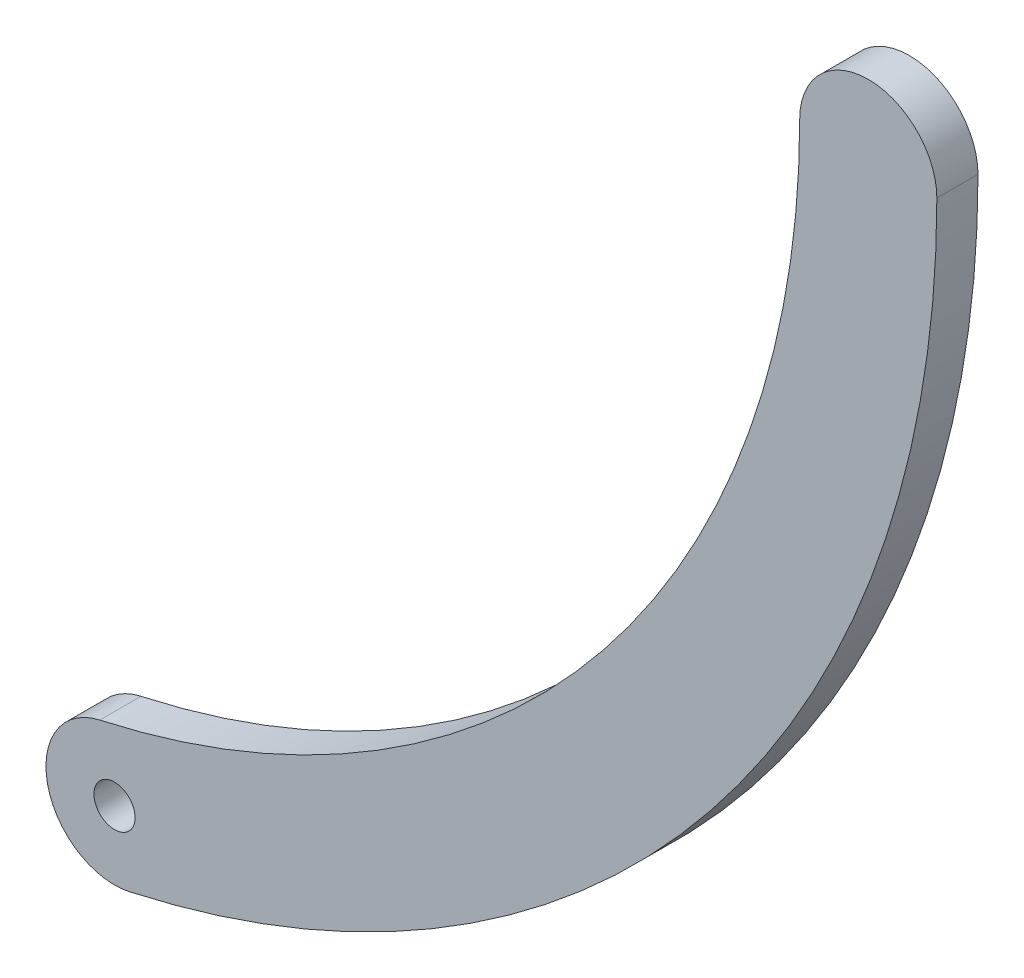
ISO-10303-21;
HEADER;
FILE_DESCRIPTION(('STEP AP214'),'2;1');
FILE_NAME('part.step','',(''),(''),'','','');
FILE_SCHEMA(('AUTOMOTIVE_DESIGN { 1 0 10303 214 1 1 1 1 }'));
ENDSEC;
DATA;
#1=APPLICATION_CONTEXT('core data for automotive mechanical design processes');
#2=APPLICATION_PROTOCOL_DEFINITION('international standard','automotive_design',2000,#1);
#3=PRODUCT_CONTEXT('',#1,'mechanical');
#4=PRODUCT('Part','Part','',(#3));
#5=PRODUCT_RELATED_PRODUCT_CATEGORY('part','',(#4));
#6=PRODUCT_DEFINITION_FORMATION('','',#4);
#7=PRODUCT_DEFINITION_CONTEXT('part definition',#1,'design');
#8=PRODUCT_DEFINITION('design','',#6,#7);
#9=PRODUCT_DEFINITION_SHAPE('','',#8);
#10=(LENGTH_UNIT() NAMED_UNIT(*) SI_UNIT(.MILLI.,.METRE.));
#11=(NAMED_UNIT(*) PLANE_ANGLE_UNIT() SI_UNIT($,.RADIAN.));
#12=(NAMED_UNIT(*) SI_UNIT($,.STERADIAN.) SOLID_ANGLE_UNIT());
#13=UNCERTAINTY_MEASURE_WITH_UNIT(LENGTH_MEASURE(1.E-05),#10,'distance_accuracy_value','');
#14=(GEOMETRIC_REPRESENTATION_CONTEXT(3) GLOBAL_UNCERTAINTY_ASSIGNED_CONTEXT((#13)) GLOBAL_UNIT_ASSIGNED_CONTEXT((#10,
#11,#12)) REPRESENTATION_CONTEXT('',''));
#15=CARTESIAN_POINT('',(0.,0.,0.));
#16=DIRECTION('',(0.,0.,1.));
#17=DIRECTION('',(1.,0.,0.));
#18=AXIS2_PLACEMENT_3D('',#15,#16,#17);
#19=CARTESIAN_POINT('',(7.51663297986589,34.0320492715544,3.));
#20=DIRECTION('',(0.,0.,1.));
#21=DIRECTION('',(1.,0.,0.));
#22=AXIS2_PLACEMENT_3D('',#19,#20,#21);
#23=PLANE('',#22);
#24=CARTESIAN_POINT('',(15.0332659597318,-0.151283343127715,3.));
#25=DIRECTION('',(0.,0.,1.));
#26=DIRECTION('',(1.,0.,0.));
#27=AXIS2_PLACEMENT_3D('',#24,#25,#26);
#28=CIRCLE('',#27,4.99999999999999);
#29=CARTESIAN_POINT('',(13.9594612483224,4.73204988754114,3.));
#30=VERTEX_POINT('',#29);
#31=CARTESIAN_POINT('',(16.1070706711412,-5.0346165737966,3.));
#32=VERTEX_POINT('',#31);
#33=EDGE_CURVE('E84',#30,#32,#28,.T.);
#34=ORIENTED_EDGE('',*,*,#33,.T.);
#35=CARTESIAN_POINT('',(0.,68.2153818862366,3.));
#36=DIRECTION('',(0.,0.,1.));
#37=DIRECTION('',(1.,0.,0.));
#38=AXIS2_PLACEMENT_3D('',#35,#36,#37);
#39=CIRCLE('',#38,75.);
#40=CARTESIAN_POINT('',(75.,68.2153818862366,3.));
#41=VERTEX_POINT('',#40);
#42=EDGE_CURVE('E79',#32,#41,#39,.T.);
#43=ORIENTED_EDGE('',*,*,#42,.T.);
#44=CARTESIAN_POINT('',(70.,68.2153818862366,3.));
#45=DIRECTION('',(0.,0.,1.));
#46=DIRECTION('',(1.,0.,0.));
#47=AXIS2_PLACEMENT_3D('',#44,#45,#46);
#48=CIRCLE('',#47,4.99999999999998);
#49=CARTESIAN_POINT('',(65.,68.2153818862366,3.));
#50=VERTEX_POINT('',#49);
#51=EDGE_CURVE('E82',#41,#50,#48,.T.);
#52=ORIENTED_EDGE('',*,*,#51,.T.);
#53=CARTESIAN_POINT('',(0.,68.2153818862366,3.));
#54=DIRECTION('',(0.,0.,-1.));
#55=DIRECTION('',(1.,0.,0.));
#56=AXIS2_PLACEMENT_3D('',#53,#54,#55);
#57=CIRCLE('',#56,65.);
#58=EDGE_CURVE('E49',#50,#30,#57,.T.);
#59=ORIENTED_EDGE('',*,*,#58,.T.);
#60=EDGE_LOOP('',(#34,#43,#52,#59));
#61=FACE_BOUND('',#60,.T.);
#62=CARTESIAN_POINT('',(15.0332659597318,-0.151283343127715,3.));
#63=DIRECTION('',(0.,0.,1.));
#64=DIRECTION('',(1.,0.,0.));
#65=AXIS2_PLACEMENT_3D('',#62,#63,#64);
#66=CIRCLE('',#65,1.5);
#67=CARTESIAN_POINT('',(16.5332659597318,-0.151283343127715,3.));
#68=VERTEX_POINT('',#67);
#69=EDGE_CURVE('E99',#68,#68,#66,.T.);
#70=ORIENTED_EDGE('',*,*,#69,.F.);
#71=EDGE_LOOP('',(#70));
#72=FACE_BOUND('',#71,.T.);
#73=ADVANCED_FACE('F32',(#61,#72),#23,.T.);
#74=CARTESIAN_POINT('',(7.51663297986589,34.0320492715544,0.));
#75=DIRECTION('',(0.,0.,1.));
#76=DIRECTION('',(1.,0.,0.));
#77=AXIS2_PLACEMENT_3D('',#74,#75,#76);
#78=PLANE('',#77);
#79=CARTESIAN_POINT('',(15.0332659597318,-0.151283343127715,0.));
#80=DIRECTION('',(0.,0.,1.));
#81=DIRECTION('',(1.,0.,0.));
#82=AXIS2_PLACEMENT_3D('',#79,#80,#81);
#83=CIRCLE('',#82,4.99999999999999);
#84=CARTESIAN_POINT('',(13.9594612483224,4.73204988754114,0.));
#85=VERTEX_POINT('',#84);
#86=CARTESIAN_POINT('',(16.1070706711412,-5.0346165737966,0.));
#87=VERTEX_POINT('',#86);
#88=EDGE_CURVE('E96',#85,#87,#83,.T.);
#89=ORIENTED_EDGE('',*,*,#88,.F.);
#90=CARTESIAN_POINT('',(0.,68.2153818862366,0.));
#91=DIRECTION('',(0.,0.,-1.));
#92=DIRECTION('',(1.,0.,0.));
#93=AXIS2_PLACEMENT_3D('',#90,#91,#92);
#94=CIRCLE('',#93,65.);
#95=CARTESIAN_POINT('',(65.,68.2153818862366,0.));
#96=VERTEX_POINT('',#95);
#97=EDGE_CURVE('E72',#96,#85,#94,.T.);
#98=ORIENTED_EDGE('',*,*,#97,.F.);
#99=CARTESIAN_POINT('',(70.,68.2153818862366,0.));
#100=DIRECTION('',(0.,0.,1.));
#101=DIRECTION('',(1.,0.,0.));
#102=AXIS2_PLACEMENT_3D('',#99,#100,#101);
#103=CIRCLE('',#102,4.99999999999998);
#104=CARTESIAN_POINT('',(75.,68.2153818862366,0.));
#105=VERTEX_POINT('',#104);
#106=EDGE_CURVE('E66',#105,#96,#103,.T.);
#107=ORIENTED_EDGE('',*,*,#106,.F.);
#108=CARTESIAN_POINT('',(0.,68.2153818862366,0.));
#109=DIRECTION('',(0.,0.,1.));
#110=DIRECTION('',(1.,0.,0.));
#111=AXIS2_PLACEMENT_3D('',#108,#109,#110);
#112=CIRCLE('',#111,75.);
#113=EDGE_CURVE('E88',#87,#105,#112,.T.);
#114=ORIENTED_EDGE('',*,*,#113,.F.);
#115=EDGE_LOOP('',(#89,#98,#107,#114));
#116=FACE_BOUND('',#115,.T.);
#117=CARTESIAN_POINT('',(15.0332659597318,-0.151283343127715,0.));
#118=DIRECTION('',(0.,0.,1.));
#119=DIRECTION('',(1.,0.,0.));
#120=AXIS2_PLACEMENT_3D('',#117,#118,#119);
#121=CIRCLE('',#120,1.5);
#122=CARTESIAN_POINT('',(16.5332659597318,-0.151283343127715,0.));
#123=VERTEX_POINT('',#122);
#124=EDGE_CURVE('E111',#123,#123,#121,.T.);
#125=ORIENTED_EDGE('',*,*,#124,.T.);
#126=EDGE_LOOP('',(#125));
#127=FACE_BOUND('',#126,.T.);
#128=ADVANCED_FACE('F107',(#116,#127),#78,.F.);
#129=CARTESIAN_POINT('',(15.0332659597318,-0.151283343127715,3.));
#130=DIRECTION('',(0.,0.,-1.));
#131=DIRECTION('',(-1.,0.,0.));
#132=AXIS2_PLACEMENT_3D('',#129,#130,#131);
#133=CYLINDRICAL_SURFACE('',#132,4.99999999999999);
#134=ORIENTED_EDGE('',*,*,#88,.T.);
#135=DIRECTION('',(0.,0.,-1.));
#136=VECTOR('',#135,1.);
#137=CARTESIAN_POINT('',(16.1070706711412,-5.0346165737966,3.));
#138=LINE('',#137,#136);
#139=EDGE_CURVE('E11',#32,#87,#138,.T.);
#140=ORIENTED_EDGE('',*,*,#139,.F.);
#141=ORIENTED_EDGE('',*,*,#33,.F.);
#142=DIRECTION('',(0.,0.,-1.));
#143=VECTOR('',#142,1.);
#144=CARTESIAN_POINT('',(13.9594612483224,4.73204988754114,3.));
#145=LINE('',#144,#143);
#146=EDGE_CURVE('E92',#30,#85,#145,.T.);
#147=ORIENTED_EDGE('',*,*,#146,.T.);
#148=EDGE_LOOP('',(#134,#140,#141,#147));
#149=FACE_BOUND('',#148,.T.);
#150=ADVANCED_FACE('F34',(#149),#133,.T.);
#151=CARTESIAN_POINT('',(0.,68.2153818862366,3.));
#152=DIRECTION('',(0.,0.,-1.));
#153=DIRECTION('',(-1.,0.,0.));
#154=AXIS2_PLACEMENT_3D('',#151,#152,#153);
#155=CYLINDRICAL_SURFACE('',#154,75.);
#156=ORIENTED_EDGE('',*,*,#113,.T.);
#157=DIRECTION('',(0.,0.,-1.));
#158=VECTOR('',#157,1.);
#159=CARTESIAN_POINT('',(75.,68.2153818862366,3.));
#160=LINE('',#159,#158);
#161=EDGE_CURVE('E41',#41,#105,#160,.T.);
#162=ORIENTED_EDGE('',*,*,#161,.F.);
#163=ORIENTED_EDGE('',*,*,#42,.F.);
#164=ORIENTED_EDGE('',*,*,#139,.T.);
#165=EDGE_LOOP('',(#156,#162,#163,#164));
#166=FACE_BOUND('',#165,.T.);
#167=ADVANCED_FACE('F87',(#166),#155,.T.);
#168=CARTESIAN_POINT('',(70.,68.2153818862366,3.));
#169=DIRECTION('',(0.,0.,-1.));
#170=DIRECTION('',(-1.,0.,0.));
#171=AXIS2_PLACEMENT_3D('',#168,#169,#170);
#172=CYLINDRICAL_SURFACE('',#171,4.99999999999998);
#173=ORIENTED_EDGE('',*,*,#106,.T.);
#174=DIRECTION('',(0.,0.,-1.));
#175=VECTOR('',#174,1.);
#176=CARTESIAN_POINT('',(65.,68.2153818862366,3.));
#177=LINE('',#176,#175);
#178=EDGE_CURVE('E89',#50,#96,#177,.T.);
#179=ORIENTED_EDGE('',*,*,#178,.F.);
#180=ORIENTED_EDGE('',*,*,#51,.F.);
#181=ORIENTED_EDGE('',*,*,#161,.T.);
#182=EDGE_LOOP('',(#173,#179,#180,#181));
#183=FACE_BOUND('',#182,.T.);
#184=ADVANCED_FACE('F90',(#183),#172,.T.);
#185=CARTESIAN_POINT('',(0.,68.2153818862366,3.));
#186=DIRECTION('',(0.,0.,-1.));
#187=DIRECTION('',(-1.,0.,0.));
#188=AXIS2_PLACEMENT_3D('',#185,#186,#187);
#189=CYLINDRICAL_SURFACE('',#188,65.);
#190=ORIENTED_EDGE('',*,*,#97,.T.);
#191=ORIENTED_EDGE('',*,*,#146,.F.);
#192=ORIENTED_EDGE('',*,*,#58,.F.);
#193=ORIENTED_EDGE('',*,*,#178,.T.);
#194=EDGE_LOOP('',(#190,#191,#192,#193));
#195=FACE_BOUND('',#194,.T.);
#196=ADVANCED_FACE('F104',(#195),#189,.F.);
#197=CARTESIAN_POINT('',(15.0332659597318,-0.151283343127715,3.));
#198=DIRECTION('',(0.,0.,-1.));
#199=DIRECTION('',(-1.,0.,0.));
#200=AXIS2_PLACEMENT_3D('',#197,#198,#199);
#201=CYLINDRICAL_SURFACE('',#200,1.5);
#202=ORIENTED_EDGE('',*,*,#69,.T.);
#203=EDGE_LOOP('',(#202));
#204=FACE_BOUND('',#203,.T.);
#205=ORIENTED_EDGE('',*,*,#124,.F.);
#206=EDGE_LOOP('',(#205));
#207=FACE_BOUND('',#206,.T.);
#208=ADVANCED_FACE('F117',(#204,#207),#201,.F.);
#209=CLOSED_SHELL('',(#73,#128,#150,#167,#184,#196,#208));
#210=MANIFOLD_SOLID_BREP('B2',#209);
#211=ADVANCED_BREP_SHAPE_REPRESENTATION('',(#18,#210),#14);
#212=SHAPE_DEFINITION_REPRESENTATION(#9,#211);
ENDSEC;
END-ISO-10303-21;
